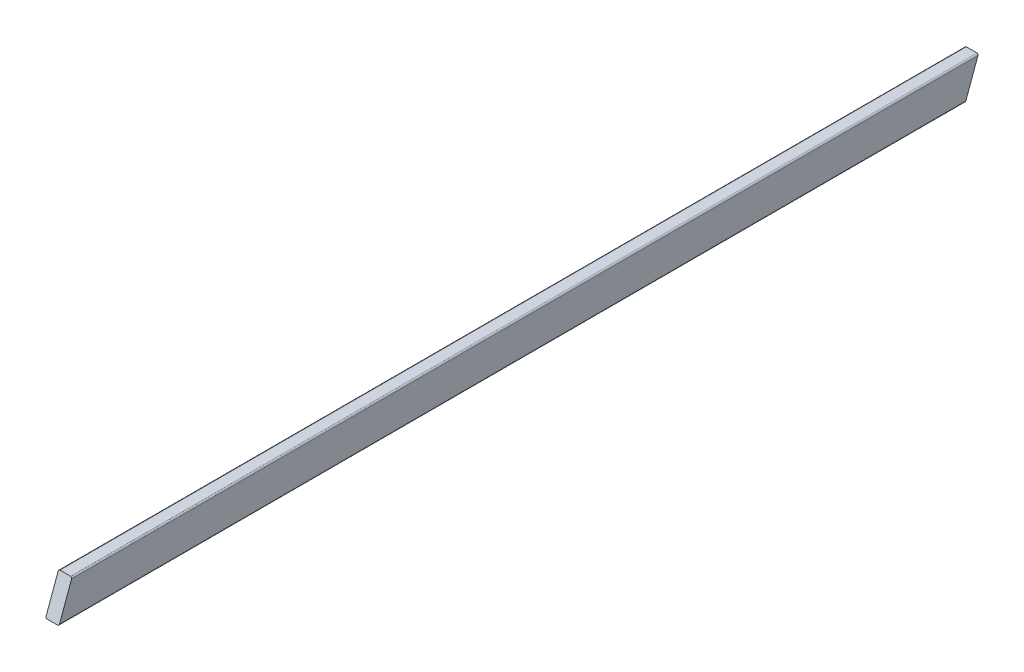
ISO-10303-21;
HEADER;
FILE_DESCRIPTION(('STEP AP214'),'2;1');
FILE_NAME('part.step','',(''),(''),'','','');
FILE_SCHEMA(('AUTOMOTIVE_DESIGN { 1 0 10303 214 1 1 1 1 }'));
ENDSEC;
DATA;
#1=APPLICATION_CONTEXT('core data for automotive mechanical design processes');
#2=APPLICATION_PROTOCOL_DEFINITION('international standard','automotive_design',2000,#1);
#3=PRODUCT_CONTEXT('',#1,'mechanical');
#4=PRODUCT('Part','Part','',(#3));
#5=PRODUCT_RELATED_PRODUCT_CATEGORY('part','',(#4));
#6=PRODUCT_DEFINITION_FORMATION('','',#4);
#7=PRODUCT_DEFINITION_CONTEXT('part definition',#1,'design');
#8=PRODUCT_DEFINITION('design','',#6,#7);
#9=PRODUCT_DEFINITION_SHAPE('','',#8);
#10=(LENGTH_UNIT() NAMED_UNIT(*) SI_UNIT(.MILLI.,.METRE.));
#11=(NAMED_UNIT(*) PLANE_ANGLE_UNIT() SI_UNIT($,.RADIAN.));
#12=(NAMED_UNIT(*) SI_UNIT($,.STERADIAN.) SOLID_ANGLE_UNIT());
#13=UNCERTAINTY_MEASURE_WITH_UNIT(LENGTH_MEASURE(1.E-05),#10,'distance_accuracy_value','');
#14=(GEOMETRIC_REPRESENTATION_CONTEXT(3) GLOBAL_UNCERTAINTY_ASSIGNED_CONTEXT((#13)) GLOBAL_UNIT_ASSIGNED_CONTEXT((#10,
#11,#12)) REPRESENTATION_CONTEXT('',''));
#15=CARTESIAN_POINT('',(0.,0.,0.));
#16=DIRECTION('',(0.,0.,1.));
#17=DIRECTION('',(1.,0.,0.));
#18=AXIS2_PLACEMENT_3D('',#15,#16,#17);
#19=CARTESIAN_POINT('',(4.7625,-12.7,400.));
#20=DIRECTION('',(-1.,0.,0.));
#21=DIRECTION('',(0.,0.,1.));
#22=AXIS2_PLACEMENT_3D('',#19,#20,#21);
#23=PLANE('',#22);
#24=DIRECTION('',(0.,-0.939692620785908,0.34202014332567));
#25=VECTOR('',#24,1.);
#26=CARTESIAN_POINT('',(4.7625,-12.7,326.126489706741));
#27=LINE('',#26,#25);
#28=CARTESIAN_POINT('',(4.7625,11.7,317.245615990646));
#29=VERTEX_POINT('',#28);
#30=CARTESIAN_POINT('',(4.7625,-11.7,325.762519472475));
#31=VERTEX_POINT('',#30);
#32=EDGE_CURVE('E164',#29,#31,#27,.T.);
#33=ORIENTED_EDGE('',*,*,#32,.T.);
#34=DIRECTION('',(0.,0.,-1.));
#35=VECTOR('',#34,1.);
#36=CARTESIAN_POINT('',(4.7625,-11.7,400.));
#37=LINE('',#36,#35);
#38=CARTESIAN_POINT('',(4.7625,-11.7,-317.245615990646));
#39=VERTEX_POINT('',#38);
#40=EDGE_CURVE('E145',#31,#39,#37,.T.);
#41=ORIENTED_EDGE('',*,*,#40,.T.);
#42=DIRECTION('',(0.,0.939692620785908,-0.342020143325669));
#43=VECTOR('',#42,1.);
#44=CARTESIAN_POINT('',(4.7625,-12.7,-316.881645756379));
#45=LINE('',#44,#43);
#46=CARTESIAN_POINT('',(4.7625,11.7,-325.762519472475));
#47=VERTEX_POINT('',#46);
#48=EDGE_CURVE('E162',#39,#47,#45,.T.);
#49=ORIENTED_EDGE('',*,*,#48,.T.);
#50=DIRECTION('',(0.,0.,-1.));
#51=VECTOR('',#50,1.);
#52=CARTESIAN_POINT('',(4.7625,11.7,400.));
#53=LINE('',#52,#51);
#54=EDGE_CURVE('E108',#47,#29,#53,.F.);
#55=ORIENTED_EDGE('',*,*,#54,.T.);
#56=EDGE_LOOP('',(#33,#41,#49,#55));
#57=FACE_BOUND('',#56,.T.);
#58=ADVANCED_FACE('F33',(#57),#23,.F.);
#59=CARTESIAN_POINT('',(-4.7625,12.7,400.));
#60=DIRECTION('',(0.,-1.,0.));
#61=DIRECTION('',(0.,0.,-1.));
#62=AXIS2_PLACEMENT_3D('',#59,#60,#61);
#63=PLANE('',#62);
#64=DIRECTION('',(1.,0.,0.));
#65=VECTOR('',#64,1.);
#66=CARTESIAN_POINT('',(-4.7625,12.7000000000001,-326.126489706741));
#67=LINE('',#66,#65);
#68=CARTESIAN_POINT('',(-3.7625,12.7000000000001,-326.126489706741));
#69=VERTEX_POINT('',#68);
#70=CARTESIAN_POINT('',(3.7625,12.7000000000001,-326.126489706741));
#71=VERTEX_POINT('',#70);
#72=EDGE_CURVE('E151',#69,#71,#67,.T.);
#73=ORIENTED_EDGE('',*,*,#72,.F.);
#74=DIRECTION('',(0.,0.,-1.));
#75=VECTOR('',#74,1.);
#76=CARTESIAN_POINT('',(-3.7625,12.7,400.));
#77=LINE('',#76,#75);
#78=CARTESIAN_POINT('',(-3.7625,12.7,316.881645756379));
#79=VERTEX_POINT('',#78);
#80=EDGE_CURVE('E12',#69,#79,#77,.F.);
#81=ORIENTED_EDGE('',*,*,#80,.T.);
#82=DIRECTION('',(1.,0.,0.));
#83=VECTOR('',#82,1.);
#84=CARTESIAN_POINT('',(-4.7625,12.7,316.881645756379));
#85=LINE('',#84,#83);
#86=CARTESIAN_POINT('',(3.7625,12.7,316.881645756379));
#87=VERTEX_POINT('',#86);
#88=EDGE_CURVE('E128',#79,#87,#85,.T.);
#89=ORIENTED_EDGE('',*,*,#88,.T.);
#90=DIRECTION('',(0.,0.,-1.));
#91=VECTOR('',#90,1.);
#92=CARTESIAN_POINT('',(3.7625,12.7,400.));
#93=LINE('',#92,#91);
#94=EDGE_CURVE('E41',#87,#71,#93,.T.);
#95=ORIENTED_EDGE('',*,*,#94,.T.);
#96=EDGE_LOOP('',(#73,#81,#89,#95));
#97=FACE_BOUND('',#96,.T.);
#98=ADVANCED_FACE('F150',(#97),#63,.F.);
#99=CARTESIAN_POINT('',(-4.7625,-12.7,400.));
#100=DIRECTION('',(1.,0.,0.));
#101=DIRECTION('',(0.,0.,-1.));
#102=AXIS2_PLACEMENT_3D('',#99,#100,#101);
#103=PLANE('',#102);
#104=DIRECTION('',(0.,0.939692620785908,-0.342020143325669));
#105=VECTOR('',#104,1.);
#106=CARTESIAN_POINT('',(-4.7625,-12.7,-316.881645756379));
#107=LINE('',#106,#105);
#108=CARTESIAN_POINT('',(-4.7625,-11.7,-317.245615990646));
#109=VERTEX_POINT('',#108);
#110=CARTESIAN_POINT('',(-4.7625,11.7,-325.762519472475));
#111=VERTEX_POINT('',#110);
#112=EDGE_CURVE('E120',#109,#111,#107,.T.);
#113=ORIENTED_EDGE('',*,*,#112,.F.);
#114=DIRECTION('',(0.,0.,-1.));
#115=VECTOR('',#114,1.);
#116=CARTESIAN_POINT('',(-4.7625,-11.7,400.));
#117=LINE('',#116,#115);
#118=CARTESIAN_POINT('',(-4.7625,-11.7,325.762519472475));
#119=VERTEX_POINT('',#118);
#120=EDGE_CURVE('E138',#109,#119,#117,.F.);
#121=ORIENTED_EDGE('',*,*,#120,.T.);
#122=DIRECTION('',(0.,-0.939692620785908,0.34202014332567));
#123=VECTOR('',#122,1.);
#124=CARTESIAN_POINT('',(-4.7625,-12.7,326.126489706741));
#125=LINE('',#124,#123);
#126=CARTESIAN_POINT('',(-4.7625,11.7,317.245615990646));
#127=VERTEX_POINT('',#126);
#128=EDGE_CURVE('E104',#127,#119,#125,.T.);
#129=ORIENTED_EDGE('',*,*,#128,.F.);
#130=DIRECTION('',(0.,0.,-1.));
#131=VECTOR('',#130,1.);
#132=CARTESIAN_POINT('',(-4.7625,11.7,400.));
#133=LINE('',#132,#131);
#134=EDGE_CURVE('E135',#127,#111,#133,.T.);
#135=ORIENTED_EDGE('',*,*,#134,.T.);
#136=EDGE_LOOP('',(#113,#121,#129,#135));
#137=FACE_BOUND('',#136,.T.);
#138=ADVANCED_FACE('F170',(#137),#103,.F.);
#139=CARTESIAN_POINT('',(-4.7625,-12.7,400.));
#140=DIRECTION('',(0.,1.,0.));
#141=DIRECTION('',(0.,0.,1.));
#142=AXIS2_PLACEMENT_3D('',#139,#140,#141);
#143=PLANE('',#142);
#144=DIRECTION('',(1.,0.,0.));
#145=VECTOR('',#144,1.);
#146=CARTESIAN_POINT('',(-4.7625,-12.7,326.126489706741));
#147=LINE('',#146,#145);
#148=CARTESIAN_POINT('',(-3.7625,-12.7,326.126489706741));
#149=VERTEX_POINT('',#148);
#150=CARTESIAN_POINT('',(3.7625,-12.7,326.126489706741));
#151=VERTEX_POINT('',#150);
#152=EDGE_CURVE('E101',#149,#151,#147,.T.);
#153=ORIENTED_EDGE('',*,*,#152,.F.);
#154=DIRECTION('',(0.,0.,-1.));
#155=VECTOR('',#154,1.);
#156=CARTESIAN_POINT('',(-3.7625,-12.7,400.));
#157=LINE('',#156,#155);
#158=CARTESIAN_POINT('',(-3.7625,-12.7,-316.881645756379));
#159=VERTEX_POINT('',#158);
#160=EDGE_CURVE('E115',#149,#159,#157,.T.);
#161=ORIENTED_EDGE('',*,*,#160,.T.);
#162=DIRECTION('',(1.,0.,0.));
#163=VECTOR('',#162,1.);
#164=CARTESIAN_POINT('',(-4.7625,-12.7,-316.881645756379));
#165=LINE('',#164,#163);
#166=CARTESIAN_POINT('',(3.7625,-12.7,-316.881645756379));
#167=VERTEX_POINT('',#166);
#168=EDGE_CURVE('E119',#159,#167,#165,.T.);
#169=ORIENTED_EDGE('',*,*,#168,.T.);
#170=DIRECTION('',(0.,0.,-1.));
#171=VECTOR('',#170,1.);
#172=CARTESIAN_POINT('',(3.7625,-12.7,400.));
#173=LINE('',#172,#171);
#174=EDGE_CURVE('E118',#167,#151,#173,.F.);
#175=ORIENTED_EDGE('',*,*,#174,.T.);
#176=EDGE_LOOP('',(#153,#161,#169,#175));
#177=FACE_BOUND('',#176,.T.);
#178=ADVANCED_FACE('F113',(#177),#143,.F.);
#179=CARTESIAN_POINT('',(-4.7625,-12.7,-316.881645756379));
#180=DIRECTION('',(0.,-0.342020143325669,-0.939692620785908));
#181=DIRECTION('',(0.,0.939692620785908,-0.342020143325669));
#182=AXIS2_PLACEMENT_3D('',#179,#180,#181);
#183=PLANE('',#182);
#184=ORIENTED_EDGE('',*,*,#168,.F.);
#185=CARTESIAN_POINT('',(-3.7625,-11.7,-317.245615990646));
#186=DIRECTION('',(0.,-0.342020143325669,-0.939692620785908));
#187=DIRECTION('',(0.,0.939692620785908,-0.342020143325669));
#188=AXIS2_PLACEMENT_3D('',#185,#186,#187);
#189=ELLIPSE('',#188,1.06417777247591,1.);
#190=EDGE_CURVE('E123',#159,#109,#189,.T.);
#191=ORIENTED_EDGE('',*,*,#190,.T.);
#192=ORIENTED_EDGE('',*,*,#112,.T.);
#193=CARTESIAN_POINT('',(-3.7625,11.7,-325.762519472475));
#194=DIRECTION('',(0.,-0.342020143325669,-0.939692620785908));
#195=DIRECTION('',(0.,0.939692620785908,-0.342020143325669));
#196=AXIS2_PLACEMENT_3D('',#193,#194,#195);
#197=ELLIPSE('',#196,1.06417777247591,1.);
#198=EDGE_CURVE('E126',#111,#69,#197,.T.);
#199=ORIENTED_EDGE('',*,*,#198,.T.);
#200=ORIENTED_EDGE('',*,*,#72,.T.);
#201=CARTESIAN_POINT('',(3.7625,11.7,-325.762519472475));
#202=DIRECTION('',(0.,-0.342020143325669,-0.939692620785908));
#203=DIRECTION('',(0.,0.939692620785908,-0.342020143325669));
#204=AXIS2_PLACEMENT_3D('',#201,#202,#203);
#205=ELLIPSE('',#204,1.06417777247591,1.);
#206=EDGE_CURVE('E124',#71,#47,#205,.T.);
#207=ORIENTED_EDGE('',*,*,#206,.T.);
#208=ORIENTED_EDGE('',*,*,#48,.F.);
#209=CARTESIAN_POINT('',(3.7625,-11.7,-317.245615990646));
#210=DIRECTION('',(0.,-0.342020143325669,-0.939692620785908));
#211=DIRECTION('',(0.,0.939692620785908,-0.342020143325669));
#212=AXIS2_PLACEMENT_3D('',#209,#210,#211);
#213=ELLIPSE('',#212,1.06417777247591,1.);
#214=EDGE_CURVE('E132',#39,#167,#213,.T.);
#215=ORIENTED_EDGE('',*,*,#214,.T.);
#216=EDGE_LOOP('',(#184,#191,#192,#199,#200,#207,#208,#215));
#217=FACE_BOUND('',#216,.T.);
#218=ADVANCED_FACE('F154',(#217),#183,.T.);
#219=CARTESIAN_POINT('',(-4.7625,-12.7,326.126489706741));
#220=DIRECTION('',(0.,0.34202014332567,0.939692620785908));
#221=DIRECTION('',(0.,-0.939692620785908,0.34202014332567));
#222=AXIS2_PLACEMENT_3D('',#219,#220,#221);
#223=PLANE('',#222);
#224=ORIENTED_EDGE('',*,*,#128,.T.);
#225=CARTESIAN_POINT('',(-3.7625,-11.7,325.762519472475));
#226=DIRECTION('',(0.,0.34202014332567,0.939692620785908));
#227=DIRECTION('',(0.,0.939692620785908,-0.34202014332567));
#228=AXIS2_PLACEMENT_3D('',#225,#226,#227);
#229=ELLIPSE('',#228,1.06417777247591,1.);
#230=EDGE_CURVE('E98',#119,#149,#229,.T.);
#231=ORIENTED_EDGE('',*,*,#230,.T.);
#232=ORIENTED_EDGE('',*,*,#152,.T.);
#233=CARTESIAN_POINT('',(3.7625,-11.7,325.762519472475));
#234=DIRECTION('',(0.,0.34202014332567,0.939692620785908));
#235=DIRECTION('',(0.,0.939692620785908,-0.34202014332567));
#236=AXIS2_PLACEMENT_3D('',#233,#234,#235);
#237=ELLIPSE('',#236,1.06417777247591,1.);
#238=EDGE_CURVE('E109',#151,#31,#237,.T.);
#239=ORIENTED_EDGE('',*,*,#238,.T.);
#240=ORIENTED_EDGE('',*,*,#32,.F.);
#241=CARTESIAN_POINT('',(3.7625,11.7,317.245615990646));
#242=DIRECTION('',(0.,0.34202014332567,0.939692620785908));
#243=DIRECTION('',(0.,0.939692620785908,-0.34202014332567));
#244=AXIS2_PLACEMENT_3D('',#241,#242,#243);
#245=ELLIPSE('',#244,1.06417777247591,1.);
#246=EDGE_CURVE('E48',#29,#87,#245,.T.);
#247=ORIENTED_EDGE('',*,*,#246,.T.);
#248=ORIENTED_EDGE('',*,*,#88,.F.);
#249=CARTESIAN_POINT('',(-3.7625,11.7,317.245615990646));
#250=DIRECTION('',(0.,0.34202014332567,0.939692620785908));
#251=DIRECTION('',(0.,0.939692620785908,-0.34202014332567));
#252=AXIS2_PLACEMENT_3D('',#249,#250,#251);
#253=ELLIPSE('',#252,1.06417777247591,1.);
#254=EDGE_CURVE('E141',#79,#127,#253,.T.);
#255=ORIENTED_EDGE('',*,*,#254,.T.);
#256=EDGE_LOOP('',(#224,#231,#232,#239,#240,#247,#248,#255));
#257=FACE_BOUND('',#256,.T.);
#258=ADVANCED_FACE('F100',(#257),#223,.T.);
#259=CARTESIAN_POINT('',(-3.7625,-11.7,400.));
#260=DIRECTION('',(0.,0.,-1.));
#261=DIRECTION('',(-1.,0.,0.));
#262=AXIS2_PLACEMENT_3D('',#259,#260,#261);
#263=CYLINDRICAL_SURFACE('',#262,1.);
#264=ORIENTED_EDGE('',*,*,#230,.F.);
#265=ORIENTED_EDGE('',*,*,#120,.F.);
#266=ORIENTED_EDGE('',*,*,#190,.F.);
#267=ORIENTED_EDGE('',*,*,#160,.F.);
#268=EDGE_LOOP('',(#264,#265,#266,#267));
#269=FACE_BOUND('',#268,.T.);
#270=ADVANCED_FACE('F122',(#269),#263,.T.);
#271=CARTESIAN_POINT('',(3.7625,-11.7,400.));
#272=DIRECTION('',(0.,0.,-1.));
#273=DIRECTION('',(-1.,0.,0.));
#274=AXIS2_PLACEMENT_3D('',#271,#272,#273);
#275=CYLINDRICAL_SURFACE('',#274,1.);
#276=ORIENTED_EDGE('',*,*,#238,.F.);
#277=ORIENTED_EDGE('',*,*,#174,.F.);
#278=ORIENTED_EDGE('',*,*,#214,.F.);
#279=ORIENTED_EDGE('',*,*,#40,.F.);
#280=EDGE_LOOP('',(#276,#277,#278,#279));
#281=FACE_BOUND('',#280,.T.);
#282=ADVANCED_FACE('F176',(#281),#275,.T.);
#283=CARTESIAN_POINT('',(-3.7625,11.7,400.));
#284=DIRECTION('',(0.,0.,-1.));
#285=DIRECTION('',(-1.,0.,0.));
#286=AXIS2_PLACEMENT_3D('',#283,#284,#285);
#287=CYLINDRICAL_SURFACE('',#286,1.);
#288=ORIENTED_EDGE('',*,*,#254,.F.);
#289=ORIENTED_EDGE('',*,*,#80,.F.);
#290=ORIENTED_EDGE('',*,*,#198,.F.);
#291=ORIENTED_EDGE('',*,*,#134,.F.);
#292=EDGE_LOOP('',(#288,#289,#290,#291));
#293=FACE_BOUND('',#292,.T.);
#294=ADVANCED_FACE('F174',(#293),#287,.T.);
#295=CARTESIAN_POINT('',(3.7625,11.7,400.));
#296=DIRECTION('',(0.,0.,-1.));
#297=DIRECTION('',(-1.,0.,0.));
#298=AXIS2_PLACEMENT_3D('',#295,#296,#297);
#299=CYLINDRICAL_SURFACE('',#298,1.);
#300=ORIENTED_EDGE('',*,*,#246,.F.);
#301=ORIENTED_EDGE('',*,*,#54,.F.);
#302=ORIENTED_EDGE('',*,*,#206,.F.);
#303=ORIENTED_EDGE('',*,*,#94,.F.);
#304=EDGE_LOOP('',(#300,#301,#302,#303));
#305=FACE_BOUND('',#304,.T.);
#306=ADVANCED_FACE('F35',(#305),#299,.T.);
#307=CLOSED_SHELL('',(#58,#98,#138,#178,#218,#258,#270,#282,#294,#306));
#308=MANIFOLD_SOLID_BREP('B2',#307);
#309=ADVANCED_BREP_SHAPE_REPRESENTATION('',(#18,#308),#14);
#310=SHAPE_DEFINITION_REPRESENTATION(#9,#309);
ENDSEC;
END-ISO-10303-21;
